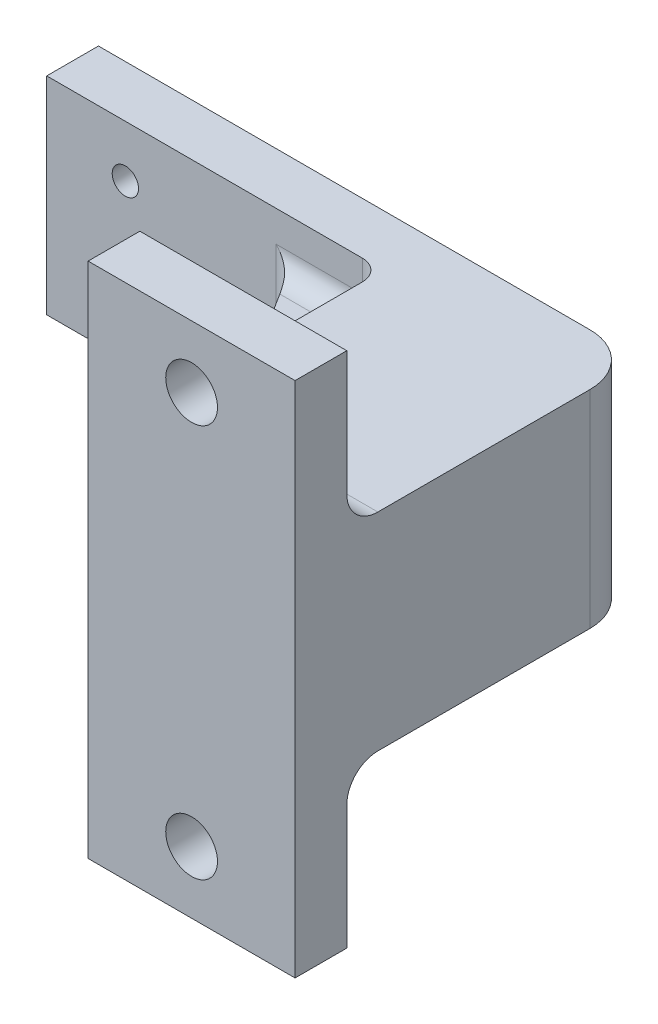
ISO-10303-21;
HEADER;
FILE_DESCRIPTION(('STEP AP214'),'2;1');
FILE_NAME('part.step','',(''),(''),'','','');
FILE_SCHEMA(('AUTOMOTIVE_DESIGN { 1 0 10303 214 1 1 1 1 }'));
ENDSEC;
DATA;
#1=APPLICATION_CONTEXT('core data for automotive mechanical design processes');
#2=APPLICATION_PROTOCOL_DEFINITION('international standard','automotive_design',2000,#1);
#3=PRODUCT_CONTEXT('',#1,'mechanical');
#4=PRODUCT('Part','Part','',(#3));
#5=PRODUCT_RELATED_PRODUCT_CATEGORY('part','',(#4));
#6=PRODUCT_DEFINITION_FORMATION('','',#4);
#7=PRODUCT_DEFINITION_CONTEXT('part definition',#1,'design');
#8=PRODUCT_DEFINITION('design','',#6,#7);
#9=PRODUCT_DEFINITION_SHAPE('','',#8);
#10=(LENGTH_UNIT() NAMED_UNIT(*) SI_UNIT(.MILLI.,.METRE.));
#11=(NAMED_UNIT(*) PLANE_ANGLE_UNIT() SI_UNIT($,.RADIAN.));
#12=(NAMED_UNIT(*) SI_UNIT($,.STERADIAN.) SOLID_ANGLE_UNIT());
#13=UNCERTAINTY_MEASURE_WITH_UNIT(LENGTH_MEASURE(1.E-05),#10,'distance_accuracy_value','');
#14=(GEOMETRIC_REPRESENTATION_CONTEXT(3) GLOBAL_UNCERTAINTY_ASSIGNED_CONTEXT((#13)) GLOBAL_UNIT_ASSIGNED_CONTEXT((#10,
#11,#12)) REPRESENTATION_CONTEXT('',''));
#15=CARTESIAN_POINT('',(0.,0.,0.));
#16=DIRECTION('',(0.,0.,1.));
#17=DIRECTION('',(1.,0.,0.));
#18=AXIS2_PLACEMENT_3D('',#15,#16,#17);
#19=CARTESIAN_POINT('',(0.,-20.,5.));
#20=DIRECTION('',(0.,1.,0.));
#21=DIRECTION('',(0.,0.,1.));
#22=AXIS2_PLACEMENT_3D('',#19,#20,#21);
#23=PLANE('',#22);
#24=DIRECTION('',(1.,0.,0.));
#25=VECTOR('',#24,1.);
#26=CARTESIAN_POINT('',(0.,-20.,0.));
#27=LINE('',#26,#25);
#28=CARTESIAN_POINT('',(0.,-20.,0.));
#29=VERTEX_POINT('',#28);
#30=CARTESIAN_POINT('',(47.5,-20.,0.));
#31=VERTEX_POINT('',#30);
#32=EDGE_CURVE('E257',#29,#31,#27,.T.);
#33=ORIENTED_EDGE('',*,*,#32,.T.);
#34=CARTESIAN_POINT('',(47.5,-20.,5.));
#35=DIRECTION('',(0.,1.,0.));
#36=DIRECTION('',(0.,0.,1.));
#37=AXIS2_PLACEMENT_3D('',#34,#35,#36);
#38=CIRCLE('',#37,5.);
#39=CARTESIAN_POINT('',(52.5,-20.,5.));
#40=VERTEX_POINT('',#39);
#41=EDGE_CURVE('E303',#31,#40,#38,.F.);
#42=ORIENTED_EDGE('',*,*,#41,.T.);
#43=DIRECTION('',(0.,0.,-1.));
#44=VECTOR('',#43,1.);
#45=CARTESIAN_POINT('',(52.5,-20.,5.));
#46=LINE('',#45,#44);
#47=CARTESIAN_POINT('',(52.5,-20.,25.5));
#48=VERTEX_POINT('',#47);
#49=EDGE_CURVE('E266',#48,#40,#46,.T.);
#50=ORIENTED_EDGE('',*,*,#49,.F.);
#51=DIRECTION('',(1.,0.,0.));
#52=VECTOR('',#51,1.);
#53=CARTESIAN_POINT('',(32.5,-20.,25.5));
#54=LINE('',#53,#52);
#55=CARTESIAN_POINT('',(32.5,-20.,25.5));
#56=VERTEX_POINT('',#55);
#57=EDGE_CURVE('E287',#48,#56,#54,.F.);
#58=ORIENTED_EDGE('',*,*,#57,.T.);
#59=DIRECTION('',(0.,0.,-1.));
#60=VECTOR('',#59,1.);
#61=CARTESIAN_POINT('',(32.5,-20.,33.5));
#62=LINE('',#61,#60);
#63=CARTESIAN_POINT('',(32.5,-20.,7.00000000000001));
#64=VERTEX_POINT('',#63);
#65=EDGE_CURVE('E226',#56,#64,#62,.T.);
#66=ORIENTED_EDGE('',*,*,#65,.T.);
#67=CARTESIAN_POINT('',(30.5,-20.,7.));
#68=DIRECTION('',(0.,1.,0.));
#69=DIRECTION('',(0.,0.,1.));
#70=AXIS2_PLACEMENT_3D('',#67,#68,#69);
#71=CIRCLE('',#70,2.);
#72=CARTESIAN_POINT('',(30.5,-20.,5.));
#73=VERTEX_POINT('',#72);
#74=EDGE_CURVE('E11',#64,#73,#71,.T.);
#75=ORIENTED_EDGE('',*,*,#74,.T.);
#76=DIRECTION('',(1.,0.,0.));
#77=VECTOR('',#76,1.);
#78=CARTESIAN_POINT('',(0.,-20.,5.));
#79=LINE('',#78,#77);
#80=CARTESIAN_POINT('',(0.,-20.,5.));
#81=VERTEX_POINT('',#80);
#82=EDGE_CURVE('E248',#81,#73,#79,.T.);
#83=ORIENTED_EDGE('',*,*,#82,.F.);
#84=DIRECTION('',(0.,0.,-1.));
#85=VECTOR('',#84,1.);
#86=CARTESIAN_POINT('',(0.,-20.,5.));
#87=LINE('',#86,#85);
#88=EDGE_CURVE('E268',#81,#29,#87,.T.);
#89=ORIENTED_EDGE('',*,*,#88,.T.);
#90=EDGE_LOOP('',(#33,#42,#50,#58,#66,#75,#83,#89));
#91=FACE_BOUND('',#90,.T.);
#92=ADVANCED_FACE('F35',(#91),#23,.F.);
#93=CARTESIAN_POINT('',(0.,0.,5.));
#94=DIRECTION('',(0.,-1.,0.));
#95=DIRECTION('',(0.,0.,-1.));
#96=AXIS2_PLACEMENT_3D('',#93,#94,#95);
#97=PLANE('',#96);
#98=DIRECTION('',(0.,0.,-1.));
#99=VECTOR('',#98,1.);
#100=CARTESIAN_POINT('',(52.5,0.,5.));
#101=LINE('',#100,#99);
#102=CARTESIAN_POINT('',(52.5,0.,25.5));
#103=VERTEX_POINT('',#102);
#104=CARTESIAN_POINT('',(52.5,0.,5.));
#105=VERTEX_POINT('',#104);
#106=EDGE_CURVE('E263',#103,#105,#101,.T.);
#107=ORIENTED_EDGE('',*,*,#106,.T.);
#108=CARTESIAN_POINT('',(47.5,0.,5.));
#109=DIRECTION('',(0.,-1.,0.));
#110=DIRECTION('',(0.,0.,-1.));
#111=AXIS2_PLACEMENT_3D('',#108,#109,#110);
#112=CIRCLE('',#111,5.);
#113=CARTESIAN_POINT('',(47.5,0.,0.));
#114=VERTEX_POINT('',#113);
#115=EDGE_CURVE('E299',#105,#114,#112,.F.);
#116=ORIENTED_EDGE('',*,*,#115,.T.);
#117=DIRECTION('',(-1.,0.,0.));
#118=VECTOR('',#117,1.);
#119=CARTESIAN_POINT('',(0.,0.,0.));
#120=LINE('',#119,#118);
#121=CARTESIAN_POINT('',(0.,0.,0.));
#122=VERTEX_POINT('',#121);
#123=EDGE_CURVE('E249',#114,#122,#120,.T.);
#124=ORIENTED_EDGE('',*,*,#123,.T.);
#125=DIRECTION('',(0.,0.,-1.));
#126=VECTOR('',#125,1.);
#127=CARTESIAN_POINT('',(0.,0.,5.));
#128=LINE('',#127,#126);
#129=CARTESIAN_POINT('',(0.,0.,5.));
#130=VERTEX_POINT('',#129);
#131=EDGE_CURVE('E254',#130,#122,#128,.T.);
#132=ORIENTED_EDGE('',*,*,#131,.F.);
#133=DIRECTION('',(-1.,0.,0.));
#134=VECTOR('',#133,1.);
#135=CARTESIAN_POINT('',(0.,0.,5.));
#136=LINE('',#135,#134);
#137=CARTESIAN_POINT('',(30.5,0.,5.));
#138=VERTEX_POINT('',#137);
#139=EDGE_CURVE('E252',#138,#130,#136,.T.);
#140=ORIENTED_EDGE('',*,*,#139,.F.);
#141=CARTESIAN_POINT('',(30.5,0.,7.));
#142=DIRECTION('',(0.,-1.,0.));
#143=DIRECTION('',(0.,0.,-1.));
#144=AXIS2_PLACEMENT_3D('',#141,#142,#143);
#145=CIRCLE('',#144,2.);
#146=CARTESIAN_POINT('',(32.5,0.,7.00000000000001));
#147=VERTEX_POINT('',#146);
#148=EDGE_CURVE('E44',#138,#147,#145,.T.);
#149=ORIENTED_EDGE('',*,*,#148,.T.);
#150=DIRECTION('',(0.,0.,-1.));
#151=VECTOR('',#150,1.);
#152=CARTESIAN_POINT('',(32.5,0.,33.5));
#153=LINE('',#152,#151);
#154=CARTESIAN_POINT('',(32.5,0.,25.5));
#155=VERTEX_POINT('',#154);
#156=EDGE_CURVE('E229',#155,#147,#153,.T.);
#157=ORIENTED_EDGE('',*,*,#156,.F.);
#158=DIRECTION('',(-1.,0.,0.));
#159=VECTOR('',#158,1.);
#160=CARTESIAN_POINT('',(52.5,0.,25.5));
#161=LINE('',#160,#159);
#162=EDGE_CURVE('E282',#155,#103,#161,.F.);
#163=ORIENTED_EDGE('',*,*,#162,.T.);
#164=EDGE_LOOP('',(#107,#116,#124,#132,#140,#149,#157,#163));
#165=FACE_BOUND('',#164,.T.);
#166=ADVANCED_FACE('F448',(#165),#97,.F.);
#167=CARTESIAN_POINT('',(0.,0.,5.));
#168=DIRECTION('',(0.,0.,1.));
#169=DIRECTION('',(1.,0.,0.));
#170=AXIS2_PLACEMENT_3D('',#167,#168,#169);
#171=PLANE('',#170);
#172=DIRECTION('',(-1.,0.,0.));
#173=VECTOR('',#172,1.);
#174=CARTESIAN_POINT('',(32.5,-3.,5.));
#175=LINE('',#174,#173);
#176=CARTESIAN_POINT('',(22.1635138026246,-3.,5.));
#177=VERTEX_POINT('',#176);
#178=CARTESIAN_POINT('',(30.5,-3.,5.));
#179=VERTEX_POINT('',#178);
#180=EDGE_CURVE('E334',#177,#179,#175,.F.);
#181=ORIENTED_EDGE('',*,*,#180,.T.);
#182=DIRECTION('',(0.,-1.,0.));
#183=VECTOR('',#182,1.);
#184=CARTESIAN_POINT('',(30.5,0.,5.));
#185=LINE('',#184,#183);
#186=EDGE_CURVE('E336',#179,#138,#185,.F.);
#187=ORIENTED_EDGE('',*,*,#186,.T.);
#188=ORIENTED_EDGE('',*,*,#139,.T.);
#189=DIRECTION('',(0.,-1.,0.));
#190=VECTOR('',#189,1.);
#191=CARTESIAN_POINT('',(0.,0.,5.));
#192=LINE('',#191,#190);
#193=EDGE_CURVE('E245',#130,#81,#192,.T.);
#194=ORIENTED_EDGE('',*,*,#193,.T.);
#195=ORIENTED_EDGE('',*,*,#82,.T.);
#196=DIRECTION('',(0.,-1.,0.));
#197=VECTOR('',#196,1.);
#198=CARTESIAN_POINT('',(30.5,0.,5.));
#199=LINE('',#198,#197);
#200=CARTESIAN_POINT('',(30.5,-17.,5.));
#201=VERTEX_POINT('',#200);
#202=EDGE_CURVE('E328',#73,#201,#199,.F.);
#203=ORIENTED_EDGE('',*,*,#202,.T.);
#204=DIRECTION('',(-1.,0.,0.));
#205=VECTOR('',#204,1.);
#206=CARTESIAN_POINT('',(0.,-17.,5.));
#207=LINE('',#206,#205);
#208=CARTESIAN_POINT('',(22.1635138026246,-17.,5.));
#209=VERTEX_POINT('',#208);
#210=EDGE_CURVE('E330',#201,#209,#207,.T.);
#211=ORIENTED_EDGE('',*,*,#210,.T.);
#212=DIRECTION('',(0.,-1.,0.));
#213=VECTOR('',#212,1.);
#214=CARTESIAN_POINT('',(22.1635138026246,-5.,5.));
#215=LINE('',#214,#213);
#216=EDGE_CURVE('E332',#209,#177,#215,.F.);
#217=ORIENTED_EDGE('',*,*,#216,.T.);
#218=EDGE_LOOP('',(#181,#187,#188,#194,#195,#203,#211,#217));
#219=FACE_BOUND('',#218,.T.);
#220=CARTESIAN_POINT('',(7.6,-5.,5.));
#221=DIRECTION('',(0.,0.,1.));
#222=DIRECTION('',(1.,0.,0.));
#223=AXIS2_PLACEMENT_3D('',#220,#221,#222);
#224=CIRCLE('',#223,1.27);
#225=CARTESIAN_POINT('',(8.87,-5.,5.));
#226=VERTEX_POINT('',#225);
#227=EDGE_CURVE('E239',#226,#226,#224,.T.);
#228=ORIENTED_EDGE('',*,*,#227,.F.);
#229=EDGE_LOOP('',(#228));
#230=FACE_BOUND('',#229,.T.);
#231=CARTESIAN_POINT('',(7.6,-15.,5.));
#232=DIRECTION('',(0.,0.,1.));
#233=DIRECTION('',(1.,0.,0.));
#234=AXIS2_PLACEMENT_3D('',#231,#232,#233);
#235=CIRCLE('',#234,1.25);
#236=CARTESIAN_POINT('',(8.85,-15.,5.));
#237=VERTEX_POINT('',#236);
#238=EDGE_CURVE('E233',#237,#237,#235,.T.);
#239=ORIENTED_EDGE('',*,*,#238,.F.);
#240=EDGE_LOOP('',(#239));
#241=FACE_BOUND('',#240,.T.);
#242=ADVANCED_FACE('F431',(#219,#230,#241),#171,.T.);
#243=CARTESIAN_POINT('',(0.,0.,0.));
#244=DIRECTION('',(0.,0.,1.));
#245=DIRECTION('',(1.,0.,0.));
#246=AXIS2_PLACEMENT_3D('',#243,#244,#245);
#247=PLANE('',#246);
#248=ORIENTED_EDGE('',*,*,#123,.F.);
#249=DIRECTION('',(0.,1.,0.));
#250=VECTOR('',#249,1.);
#251=CARTESIAN_POINT('',(47.5,0.,0.));
#252=LINE('',#251,#250);
#253=EDGE_CURVE('E301',#114,#31,#252,.F.);
#254=ORIENTED_EDGE('',*,*,#253,.T.);
#255=ORIENTED_EDGE('',*,*,#32,.F.);
#256=DIRECTION('',(0.,-1.,0.));
#257=VECTOR('',#256,1.);
#258=CARTESIAN_POINT('',(0.,0.,0.));
#259=LINE('',#258,#257);
#260=EDGE_CURVE('E242',#122,#29,#259,.T.);
#261=ORIENTED_EDGE('',*,*,#260,.F.);
#262=EDGE_LOOP('',(#248,#254,#255,#261));
#263=FACE_BOUND('',#262,.T.);
#264=CARTESIAN_POINT('',(7.6,-5.,0.));
#265=DIRECTION('',(0.,0.,1.));
#266=DIRECTION('',(1.,0.,0.));
#267=AXIS2_PLACEMENT_3D('',#264,#265,#266);
#268=CIRCLE('',#267,1.27);
#269=CARTESIAN_POINT('',(8.87,-5.,0.));
#270=VERTEX_POINT('',#269);
#271=EDGE_CURVE('E236',#270,#270,#268,.T.);
#272=ORIENTED_EDGE('',*,*,#271,.T.);
#273=EDGE_LOOP('',(#272));
#274=FACE_BOUND('',#273,.T.);
#275=CARTESIAN_POINT('',(7.6,-15.,0.));
#276=DIRECTION('',(0.,0.,1.));
#277=DIRECTION('',(1.,0.,0.));
#278=AXIS2_PLACEMENT_3D('',#275,#276,#277);
#279=CIRCLE('',#278,1.25);
#280=CARTESIAN_POINT('',(8.85,-15.,0.));
#281=VERTEX_POINT('',#280);
#282=EDGE_CURVE('E232',#281,#281,#279,.T.);
#283=ORIENTED_EDGE('',*,*,#282,.T.);
#284=EDGE_LOOP('',(#283));
#285=FACE_BOUND('',#284,.T.);
#286=ADVANCED_FACE('F504',(#263,#274,#285),#247,.F.);
#287=CARTESIAN_POINT('',(0.,0.,5.));
#288=DIRECTION('',(1.,0.,0.));
#289=DIRECTION('',(0.,0.,-1.));
#290=AXIS2_PLACEMENT_3D('',#287,#288,#289);
#291=PLANE('',#290);
#292=ORIENTED_EDGE('',*,*,#260,.T.);
#293=ORIENTED_EDGE('',*,*,#88,.F.);
#294=ORIENTED_EDGE('',*,*,#193,.F.);
#295=ORIENTED_EDGE('',*,*,#131,.T.);
#296=EDGE_LOOP('',(#292,#293,#294,#295));
#297=FACE_BOUND('',#296,.T.);
#298=ADVANCED_FACE('F439',(#297),#291,.F.);
#299=CARTESIAN_POINT('',(52.5,0.,5.));
#300=DIRECTION('',(-1.,0.,0.));
#301=DIRECTION('',(0.,0.,1.));
#302=AXIS2_PLACEMENT_3D('',#299,#300,#301);
#303=PLANE('',#302);
#304=ORIENTED_EDGE('',*,*,#49,.T.);
#305=DIRECTION('',(0.,1.,0.));
#306=VECTOR('',#305,1.);
#307=CARTESIAN_POINT('',(52.5,0.,5.));
#308=LINE('',#307,#306);
#309=EDGE_CURVE('E296',#40,#105,#308,.T.);
#310=ORIENTED_EDGE('',*,*,#309,.T.);
#311=ORIENTED_EDGE('',*,*,#106,.F.);
#312=CARTESIAN_POINT('',(52.5,3.,25.5));
#313=DIRECTION('',(-1.,0.,0.));
#314=DIRECTION('',(0.,0.,1.));
#315=AXIS2_PLACEMENT_3D('',#312,#313,#314);
#316=CIRCLE('',#315,3.);
#317=CARTESIAN_POINT('',(52.5,3.,28.5));
#318=VERTEX_POINT('',#317);
#319=EDGE_CURVE('E216',#103,#318,#316,.T.);
#320=ORIENTED_EDGE('',*,*,#319,.T.);
#321=DIRECTION('',(0.,-1.,0.));
#322=VECTOR('',#321,1.);
#323=CARTESIAN_POINT('',(52.5,15.,28.5));
#324=LINE('',#323,#322);
#325=CARTESIAN_POINT('',(52.5,15.,28.5));
#326=VERTEX_POINT('',#325);
#327=EDGE_CURVE('E194',#326,#318,#324,.T.);
#328=ORIENTED_EDGE('',*,*,#327,.F.);
#329=DIRECTION('',(0.,0.,-1.));
#330=VECTOR('',#329,1.);
#331=CARTESIAN_POINT('',(52.5,15.,33.5));
#332=LINE('',#331,#330);
#333=CARTESIAN_POINT('',(52.5,15.,33.5));
#334=VERTEX_POINT('',#333);
#335=EDGE_CURVE('E202',#334,#326,#332,.T.);
#336=ORIENTED_EDGE('',*,*,#335,.F.);
#337=DIRECTION('',(0.,1.,0.));
#338=VECTOR('',#337,1.);
#339=CARTESIAN_POINT('',(52.5,0.,33.5));
#340=LINE('',#339,#338);
#341=CARTESIAN_POINT('',(52.5,-35.,33.5));
#342=VERTEX_POINT('',#341);
#343=EDGE_CURVE('E217',#342,#334,#340,.T.);
#344=ORIENTED_EDGE('',*,*,#343,.F.);
#345=DIRECTION('',(0.,0.,-1.));
#346=VECTOR('',#345,1.);
#347=CARTESIAN_POINT('',(52.5,-35.,33.5));
#348=LINE('',#347,#346);
#349=CARTESIAN_POINT('',(52.5,-35.,28.5));
#350=VERTEX_POINT('',#349);
#351=EDGE_CURVE('E387',#342,#350,#348,.T.);
#352=ORIENTED_EDGE('',*,*,#351,.T.);
#353=CARTESIAN_POINT('',(52.5,-23.,28.5));
#354=VERTEX_POINT('',#353);
#355=EDGE_CURVE('E218',#354,#350,#324,.T.);
#356=ORIENTED_EDGE('',*,*,#355,.F.);
#357=CARTESIAN_POINT('',(52.5,-23.,25.5));
#358=DIRECTION('',(-1.,0.,0.));
#359=DIRECTION('',(0.,0.,1.));
#360=AXIS2_PLACEMENT_3D('',#357,#358,#359);
#361=CIRCLE('',#360,3.);
#362=EDGE_CURVE('E292',#354,#48,#361,.T.);
#363=ORIENTED_EDGE('',*,*,#362,.T.);
#364=EDGE_LOOP('',(#304,#310,#311,#320,#328,#336,#344,#352,#356,#363));
#365=FACE_BOUND('',#364,.T.);
#366=ADVANCED_FACE('F213',(#365),#303,.F.);
#367=CARTESIAN_POINT('',(7.6,-5.,5.));
#368=DIRECTION('',(0.,0.,-1.));
#369=DIRECTION('',(-1.,0.,0.));
#370=AXIS2_PLACEMENT_3D('',#367,#368,#369);
#371=CYLINDRICAL_SURFACE('',#370,1.27);
#372=ORIENTED_EDGE('',*,*,#227,.T.);
#373=EDGE_LOOP('',(#372));
#374=FACE_BOUND('',#373,.T.);
#375=ORIENTED_EDGE('',*,*,#271,.F.);
#376=EDGE_LOOP('',(#375));
#377=FACE_BOUND('',#376,.T.);
#378=ADVANCED_FACE('F638',(#374,#377),#371,.F.);
#379=CARTESIAN_POINT('',(7.6,-15.,5.));
#380=DIRECTION('',(0.,0.,-1.));
#381=DIRECTION('',(-1.,0.,0.));
#382=AXIS2_PLACEMENT_3D('',#379,#380,#381);
#383=CYLINDRICAL_SURFACE('',#382,1.25);
#384=ORIENTED_EDGE('',*,*,#238,.T.);
#385=EDGE_LOOP('',(#384));
#386=FACE_BOUND('',#385,.T.);
#387=ORIENTED_EDGE('',*,*,#282,.F.);
#388=EDGE_LOOP('',(#387));
#389=FACE_BOUND('',#388,.T.);
#390=ADVANCED_FACE('F606',(#386,#389),#383,.F.);
#391=CARTESIAN_POINT('',(32.5,0.,33.5));
#392=DIRECTION('',(1.,0.,0.));
#393=DIRECTION('',(0.,0.,-1.));
#394=AXIS2_PLACEMENT_3D('',#391,#392,#393);
#395=PLANE('',#394);
#396=ORIENTED_EDGE('',*,*,#156,.T.);
#397=DIRECTION('',(0.,-1.,0.));
#398=VECTOR('',#397,1.);
#399=CARTESIAN_POINT('',(32.5,0.,7.));
#400=LINE('',#399,#398);
#401=CARTESIAN_POINT('',(32.5,-3.,7.));
#402=VERTEX_POINT('',#401);
#403=EDGE_CURVE('E319',#147,#402,#400,.T.);
#404=ORIENTED_EDGE('',*,*,#403,.T.);
#405=DIRECTION('',(0.,0.,1.));
#406=VECTOR('',#405,1.);
#407=CARTESIAN_POINT('',(32.5,-3.,33.5));
#408=LINE('',#407,#406);
#409=CARTESIAN_POINT('',(32.5,-3.,20.2182174012634));
#410=VERTEX_POINT('',#409);
#411=EDGE_CURVE('E317',#402,#410,#408,.T.);
#412=ORIENTED_EDGE('',*,*,#411,.T.);
#413=DIRECTION('',(0.,-1.,0.));
#414=VECTOR('',#413,1.);
#415=CARTESIAN_POINT('',(32.5,0.,20.2182174012634));
#416=LINE('',#415,#414);
#417=CARTESIAN_POINT('',(32.5,-17.,20.2182174012634));
#418=VERTEX_POINT('',#417);
#419=EDGE_CURVE('E315',#410,#418,#416,.T.);
#420=ORIENTED_EDGE('',*,*,#419,.T.);
#421=DIRECTION('',(0.,0.,1.));
#422=VECTOR('',#421,1.);
#423=CARTESIAN_POINT('',(32.5,-17.,5.));
#424=LINE('',#423,#422);
#425=CARTESIAN_POINT('',(32.5,-17.,7.));
#426=VERTEX_POINT('',#425);
#427=EDGE_CURVE('E312',#418,#426,#424,.F.);
#428=ORIENTED_EDGE('',*,*,#427,.T.);
#429=DIRECTION('',(0.,-1.,0.));
#430=VECTOR('',#429,1.);
#431=CARTESIAN_POINT('',(32.5,0.,7.));
#432=LINE('',#431,#430);
#433=EDGE_CURVE('E310',#426,#64,#432,.T.);
#434=ORIENTED_EDGE('',*,*,#433,.T.);
#435=ORIENTED_EDGE('',*,*,#65,.F.);
#436=CARTESIAN_POINT('',(32.5,-23.,25.5));
#437=DIRECTION('',(1.,0.,0.));
#438=DIRECTION('',(0.,0.,-1.));
#439=AXIS2_PLACEMENT_3D('',#436,#437,#438);
#440=CIRCLE('',#439,3.);
#441=CARTESIAN_POINT('',(32.5,-23.,28.5));
#442=VERTEX_POINT('',#441);
#443=EDGE_CURVE('E294',#56,#442,#440,.T.);
#444=ORIENTED_EDGE('',*,*,#443,.T.);
#445=DIRECTION('',(0.,-1.,0.));
#446=VECTOR('',#445,1.);
#447=CARTESIAN_POINT('',(32.5,15.,28.5));
#448=LINE('',#447,#446);
#449=CARTESIAN_POINT('',(32.5,-35.,28.5));
#450=VERTEX_POINT('',#449);
#451=EDGE_CURVE('E391',#442,#450,#448,.T.);
#452=ORIENTED_EDGE('',*,*,#451,.T.);
#453=DIRECTION('',(0.,0.,1.));
#454=VECTOR('',#453,1.);
#455=CARTESIAN_POINT('',(32.5,-35.,33.5));
#456=LINE('',#455,#454);
#457=CARTESIAN_POINT('',(32.5,-35.,33.5));
#458=VERTEX_POINT('',#457);
#459=EDGE_CURVE('E397',#450,#458,#456,.T.);
#460=ORIENTED_EDGE('',*,*,#459,.T.);
#461=DIRECTION('',(0.,-1.,0.));
#462=VECTOR('',#461,1.);
#463=CARTESIAN_POINT('',(32.5,0.,33.5));
#464=LINE('',#463,#462);
#465=CARTESIAN_POINT('',(32.5,15.,33.5));
#466=VERTEX_POINT('',#465);
#467=EDGE_CURVE('E220',#466,#458,#464,.T.);
#468=ORIENTED_EDGE('',*,*,#467,.F.);
#469=DIRECTION('',(0.,0.,1.));
#470=VECTOR('',#469,1.);
#471=CARTESIAN_POINT('',(32.5,15.,33.5));
#472=LINE('',#471,#470);
#473=CARTESIAN_POINT('',(32.5,15.,28.5));
#474=VERTEX_POINT('',#473);
#475=EDGE_CURVE('E201',#474,#466,#472,.T.);
#476=ORIENTED_EDGE('',*,*,#475,.F.);
#477=CARTESIAN_POINT('',(32.5,3.,28.5));
#478=VERTEX_POINT('',#477);
#479=EDGE_CURVE('E197',#474,#478,#448,.T.);
#480=ORIENTED_EDGE('',*,*,#479,.T.);
#481=CARTESIAN_POINT('',(32.5,3.,25.5));
#482=DIRECTION('',(1.,0.,0.));
#483=DIRECTION('',(0.,0.,-1.));
#484=AXIS2_PLACEMENT_3D('',#481,#482,#483);
#485=CIRCLE('',#484,3.);
#486=EDGE_CURVE('E289',#478,#155,#485,.T.);
#487=ORIENTED_EDGE('',*,*,#486,.T.);
#488=EDGE_LOOP('',(#396,#404,#412,#420,#428,#434,#435,#444,#452,#460,#468,#476,#480,#487));
#489=FACE_BOUND('',#488,.T.);
#490=ADVANCED_FACE('F423',(#489),#395,.F.);
#491=CARTESIAN_POINT('',(0.,0.,33.5));
#492=DIRECTION('',(0.,0.,-1.));
#493=DIRECTION('',(-1.,0.,0.));
#494=AXIS2_PLACEMENT_3D('',#491,#492,#493);
#495=PLANE('',#494);
#496=ORIENTED_EDGE('',*,*,#343,.T.);
#497=DIRECTION('',(1.,0.,0.));
#498=VECTOR('',#497,1.);
#499=CARTESIAN_POINT('',(52.5,15.,33.5));
#500=LINE('',#499,#498);
#501=EDGE_CURVE('E208',#466,#334,#500,.T.);
#502=ORIENTED_EDGE('',*,*,#501,.F.);
#503=ORIENTED_EDGE('',*,*,#467,.T.);
#504=DIRECTION('',(1.,0.,0.));
#505=VECTOR('',#504,1.);
#506=CARTESIAN_POINT('',(52.5,-35.,33.5));
#507=LINE('',#506,#505);
#508=EDGE_CURVE('E210',#458,#342,#507,.T.);
#509=ORIENTED_EDGE('',*,*,#508,.T.);
#510=EDGE_LOOP('',(#496,#502,#503,#509));
#511=FACE_BOUND('',#510,.T.);
#512=CARTESIAN_POINT('',(42.5,9.,33.5));
#513=DIRECTION('',(0.,0.,-1.));
#514=DIRECTION('',(-1.,0.,0.));
#515=AXIS2_PLACEMENT_3D('',#512,#513,#514);
#516=CIRCLE('',#515,2.5);
#517=CARTESIAN_POINT('',(40.,9.,33.5));
#518=VERTEX_POINT('',#517);
#519=EDGE_CURVE('E280',#518,#518,#516,.T.);
#520=ORIENTED_EDGE('',*,*,#519,.T.);
#521=EDGE_LOOP('',(#520));
#522=FACE_BOUND('',#521,.T.);
#523=CARTESIAN_POINT('',(42.5,-29.,33.5));
#524=DIRECTION('',(0.,0.,-1.));
#525=DIRECTION('',(-1.,0.,0.));
#526=AXIS2_PLACEMENT_3D('',#523,#524,#525);
#527=CIRCLE('',#526,2.5);
#528=CARTESIAN_POINT('',(40.,-29.,33.5));
#529=VERTEX_POINT('',#528);
#530=EDGE_CURVE('E275',#529,#529,#527,.T.);
#531=ORIENTED_EDGE('',*,*,#530,.T.);
#532=EDGE_LOOP('',(#531));
#533=FACE_BOUND('',#532,.T.);
#534=ADVANCED_FACE('F403',(#511,#522,#533),#495,.F.);
#535=CARTESIAN_POINT('',(0.,15.,0.));
#536=DIRECTION('',(0.,1.,0.));
#537=DIRECTION('',(0.,0.,1.));
#538=AXIS2_PLACEMENT_3D('',#535,#536,#537);
#539=PLANE('',#538);
#540=ORIENTED_EDGE('',*,*,#335,.T.);
#541=DIRECTION('',(-1.,0.,0.));
#542=VECTOR('',#541,1.);
#543=CARTESIAN_POINT('',(52.5,15.,28.5));
#544=LINE('',#543,#542);
#545=EDGE_CURVE('E189',#326,#474,#544,.T.);
#546=ORIENTED_EDGE('',*,*,#545,.T.);
#547=ORIENTED_EDGE('',*,*,#475,.T.);
#548=ORIENTED_EDGE('',*,*,#501,.T.);
#549=EDGE_LOOP('',(#540,#546,#547,#548));
#550=FACE_BOUND('',#549,.T.);
#551=ADVANCED_FACE('F206',(#550),#539,.T.);
#552=CARTESIAN_POINT('',(52.5,15.,28.5));
#553=DIRECTION('',(0.,0.,1.));
#554=DIRECTION('',(1.,0.,0.));
#555=AXIS2_PLACEMENT_3D('',#552,#553,#554);
#556=PLANE('',#555);
#557=CARTESIAN_POINT('',(42.5,9.,28.5));
#558=DIRECTION('',(0.,0.,1.));
#559=DIRECTION('',(1.,0.,0.));
#560=AXIS2_PLACEMENT_3D('',#557,#558,#559);
#561=CIRCLE('',#560,2.5);
#562=CARTESIAN_POINT('',(45.,9.,28.5));
#563=VERTEX_POINT('',#562);
#564=EDGE_CURVE('E277',#563,#563,#561,.T.);
#565=ORIENTED_EDGE('',*,*,#564,.T.);
#566=EDGE_LOOP('',(#565));
#567=FACE_BOUND('',#566,.T.);
#568=ORIENTED_EDGE('',*,*,#327,.T.);
#569=DIRECTION('',(-1.,0.,0.));
#570=VECTOR('',#569,1.);
#571=CARTESIAN_POINT('',(32.5,3.,28.5));
#572=LINE('',#571,#570);
#573=EDGE_CURVE('E271',#318,#478,#572,.T.);
#574=ORIENTED_EDGE('',*,*,#573,.T.);
#575=ORIENTED_EDGE('',*,*,#479,.F.);
#576=ORIENTED_EDGE('',*,*,#545,.F.);
#577=EDGE_LOOP('',(#568,#574,#575,#576));
#578=FACE_BOUND('',#577,.T.);
#579=ADVANCED_FACE('F191',(#567,#578),#556,.F.);
#580=CARTESIAN_POINT('',(42.5,-29.,28.5));
#581=DIRECTION('',(0.,0.,1.));
#582=DIRECTION('',(1.,0.,0.));
#583=AXIS2_PLACEMENT_3D('',#580,#581,#582);
#584=CIRCLE('',#583,2.5);
#585=CARTESIAN_POINT('',(45.,-29.,28.5));
#586=VERTEX_POINT('',#585);
#587=EDGE_CURVE('E272',#586,#586,#584,.T.);
#588=ORIENTED_EDGE('',*,*,#587,.T.);
#589=EDGE_LOOP('',(#588));
#590=FACE_BOUND('',#589,.T.);
#591=ORIENTED_EDGE('',*,*,#451,.F.);
#592=DIRECTION('',(1.,0.,0.));
#593=VECTOR('',#592,1.);
#594=CARTESIAN_POINT('',(52.5,-23.,28.5));
#595=LINE('',#594,#593);
#596=EDGE_CURVE('E284',#442,#354,#595,.T.);
#597=ORIENTED_EDGE('',*,*,#596,.T.);
#598=ORIENTED_EDGE('',*,*,#355,.T.);
#599=DIRECTION('',(-1.,0.,0.));
#600=VECTOR('',#599,1.);
#601=CARTESIAN_POINT('',(52.5,-35.,28.5));
#602=LINE('',#601,#600);
#603=EDGE_CURVE('E394',#350,#450,#602,.T.);
#604=ORIENTED_EDGE('',*,*,#603,.T.);
#605=EDGE_LOOP('',(#591,#597,#598,#604));
#606=FACE_BOUND('',#605,.T.);
#607=ADVANCED_FACE('F413',(#590,#606),#556,.F.);
#608=CARTESIAN_POINT('',(0.,-35.,0.));
#609=DIRECTION('',(0.,1.,0.));
#610=DIRECTION('',(0.,0.,1.));
#611=AXIS2_PLACEMENT_3D('',#608,#609,#610);
#612=PLANE('',#611);
#613=ORIENTED_EDGE('',*,*,#351,.F.);
#614=ORIENTED_EDGE('',*,*,#508,.F.);
#615=ORIENTED_EDGE('',*,*,#459,.F.);
#616=ORIENTED_EDGE('',*,*,#603,.F.);
#617=EDGE_LOOP('',(#613,#614,#615,#616));
#618=FACE_BOUND('',#617,.T.);
#619=ADVANCED_FACE('F408',(#618),#612,.F.);
#620=CARTESIAN_POINT('',(42.5,-29.,15.5));
#621=DIRECTION('',(0.,0.,1.));
#622=DIRECTION('',(1.,0.,0.));
#623=AXIS2_PLACEMENT_3D('',#620,#621,#622);
#624=CYLINDRICAL_SURFACE('',#623,2.5);
#625=ORIENTED_EDGE('',*,*,#587,.F.);
#626=EDGE_LOOP('',(#625));
#627=FACE_BOUND('',#626,.T.);
#628=ORIENTED_EDGE('',*,*,#530,.F.);
#629=EDGE_LOOP('',(#628));
#630=FACE_BOUND('',#629,.T.);
#631=ADVANCED_FACE('F692',(#627,#630),#624,.F.);
#632=CARTESIAN_POINT('',(42.5,9.,15.5));
#633=DIRECTION('',(0.,0.,1.));
#634=DIRECTION('',(1.,0.,0.));
#635=AXIS2_PLACEMENT_3D('',#632,#633,#634);
#636=CYLINDRICAL_SURFACE('',#635,2.5);
#637=ORIENTED_EDGE('',*,*,#564,.F.);
#638=EDGE_LOOP('',(#637));
#639=FACE_BOUND('',#638,.T.);
#640=ORIENTED_EDGE('',*,*,#519,.F.);
#641=EDGE_LOOP('',(#640));
#642=FACE_BOUND('',#641,.T.);
#643=ADVANCED_FACE('F507',(#639,#642),#636,.F.);
#644=CARTESIAN_POINT('',(52.5,3.,25.5));
#645=DIRECTION('',(1.,0.,0.));
#646=DIRECTION('',(0.,0.,-1.));
#647=AXIS2_PLACEMENT_3D('',#644,#645,#646);
#648=CYLINDRICAL_SURFACE('',#647,3.);
#649=ORIENTED_EDGE('',*,*,#319,.F.);
#650=ORIENTED_EDGE('',*,*,#162,.F.);
#651=ORIENTED_EDGE('',*,*,#486,.F.);
#652=ORIENTED_EDGE('',*,*,#573,.F.);
#653=EDGE_LOOP('',(#649,#650,#651,#652));
#654=FACE_BOUND('',#653,.T.);
#655=ADVANCED_FACE('F453',(#654),#648,.F.);
#656=CARTESIAN_POINT('',(52.5,-23.,25.5));
#657=DIRECTION('',(-1.,0.,0.));
#658=DIRECTION('',(0.,0.,1.));
#659=AXIS2_PLACEMENT_3D('',#656,#657,#658);
#660=CYLINDRICAL_SURFACE('',#659,3.);
#661=ORIENTED_EDGE('',*,*,#443,.F.);
#662=ORIENTED_EDGE('',*,*,#57,.F.);
#663=ORIENTED_EDGE('',*,*,#362,.F.);
#664=ORIENTED_EDGE('',*,*,#596,.F.);
#665=EDGE_LOOP('',(#661,#662,#663,#664));
#666=FACE_BOUND('',#665,.T.);
#667=ADVANCED_FACE('F417',(#666),#660,.F.);
#668=CARTESIAN_POINT('',(23.2666880253071,-10.,5.));
#669=DIRECTION('',(-0.8458314169679,0.,0.533450292032983));
#670=DIRECTION('',(0.533450292032983,0.,0.8458314169679));
#671=AXIS2_PLACEMENT_3D('',#668,#669,#670);
#672=PLANE('',#671);
#673=CARTESIAN_POINT('',(30.5,-17.,16.469039586817));
#674=DIRECTION('',(-0.8458314169679,0.,0.533450292032983));
#675=DIRECTION('',(-0.533450292032983,0.,-0.8458314169679));
#676=AXIS2_PLACEMENT_3D('',#673,#674,#675);
#677=ELLIPSE('',#676,3.74917781444638,2.);
#678=CARTESIAN_POINT('',(30.5,-15.,16.469039586817));
#679=VERTEX_POINT('',#678);
#680=CARTESIAN_POINT('',(32.1916628339358,-15.933099415934,19.1513168171974));
#681=VERTEX_POINT('',#680);
#682=EDGE_CURVE('E338',#679,#681,#677,.F.);
#683=ORIENTED_EDGE('',*,*,#682,.T.);
#684=DIRECTION('',(0.,-1.,0.));
#685=VECTOR('',#684,1.);
#686=CARTESIAN_POINT('',(32.1916628339358,-10.,19.1513168171974));
#687=LINE('',#686,#685);
#688=CARTESIAN_POINT('',(32.1916628339358,-4.06690058406597,19.1513168171974));
#689=VERTEX_POINT('',#688);
#690=EDGE_CURVE('E326',#681,#689,#687,.F.);
#691=ORIENTED_EDGE('',*,*,#690,.T.);
#692=CARTESIAN_POINT('',(30.5,-3.,16.469039586817));
#693=DIRECTION('',(-0.8458314169679,0.,0.533450292032983));
#694=DIRECTION('',(0.533450292032983,0.,0.8458314169679));
#695=AXIS2_PLACEMENT_3D('',#692,#693,#694);
#696=ELLIPSE('',#695,3.74917781444638,2.);
#697=CARTESIAN_POINT('',(30.5,-5.,16.469039586817));
#698=VERTEX_POINT('',#697);
#699=EDGE_CURVE('E341',#689,#698,#696,.F.);
#700=ORIENTED_EDGE('',*,*,#699,.T.);
#701=DIRECTION('',(0.533450292032983,0.,0.8458314169679));
#702=VECTOR('',#701,1.);
#703=CARTESIAN_POINT('',(23.2666880253071,-5.,5.));
#704=LINE('',#703,#702);
#705=CARTESIAN_POINT('',(24.5280511795519,-5.,7.));
#706=VERTEX_POINT('',#705);
#707=EDGE_CURVE('E276',#706,#698,#704,.T.);
#708=ORIENTED_EDGE('',*,*,#707,.F.);
#709=CARTESIAN_POINT('',(24.5280511795519,-3.,7.));
#710=DIRECTION('',(-0.8458314169679,0.,0.533450292032983));
#711=DIRECTION('',(0.533450292032983,0.,0.8458314169679));
#712=AXIS2_PLACEMENT_3D('',#709,#710,#711);
#713=ELLIPSE('',#712,2.36453737692732,2.);
#714=CARTESIAN_POINT('',(23.8551766365604,-4.69166283393655,5.93309941593404));
#715=VERTEX_POINT('',#714);
#716=EDGE_CURVE('E343',#706,#715,#713,.F.);
#717=ORIENTED_EDGE('',*,*,#716,.T.);
#718=DIRECTION('',(0.,-1.,0.));
#719=VECTOR('',#718,1.);
#720=CARTESIAN_POINT('',(23.8551766365604,-15.,5.93309941593404));
#721=LINE('',#720,#719);
#722=CARTESIAN_POINT('',(23.8551766365604,-15.3083371660635,5.93309941593404));
#723=VERTEX_POINT('',#722);
#724=EDGE_CURVE('E52',#715,#723,#721,.T.);
#725=ORIENTED_EDGE('',*,*,#724,.T.);
#726=CARTESIAN_POINT('',(24.5280511795519,-17.,7.));
#727=DIRECTION('',(-0.8458314169679,0.,0.533450292032983));
#728=DIRECTION('',(-0.533450292032983,0.,-0.8458314169679));
#729=AXIS2_PLACEMENT_3D('',#726,#727,#728);
#730=ELLIPSE('',#729,2.36453737692732,2.);
#731=CARTESIAN_POINT('',(24.5280511795519,-15.,7.));
#732=VERTEX_POINT('',#731);
#733=EDGE_CURVE('E345',#723,#732,#730,.F.);
#734=ORIENTED_EDGE('',*,*,#733,.T.);
#735=DIRECTION('',(0.533450292032983,0.,0.8458314169679));
#736=VECTOR('',#735,1.);
#737=CARTESIAN_POINT('',(23.2666880253071,-15.,5.));
#738=LINE('',#737,#736);
#739=EDGE_CURVE('E375',#732,#679,#738,.T.);
#740=ORIENTED_EDGE('',*,*,#739,.T.);
#741=EDGE_LOOP('',(#683,#691,#700,#708,#717,#725,#734,#740));
#742=FACE_BOUND('',#741,.T.);
#743=ADVANCED_FACE('F475',(#742),#672,.T.);
#744=CARTESIAN_POINT('',(26.25,-5.,16.75));
#745=DIRECTION('',(0.,1.,0.));
#746=DIRECTION('',(0.,0.,1.));
#747=AXIS2_PLACEMENT_3D('',#744,#745,#746);
#748=PLANE('',#747);
#749=ORIENTED_EDGE('',*,*,#707,.T.);
#750=DIRECTION('',(0.,0.,1.));
#751=VECTOR('',#750,1.);
#752=CARTESIAN_POINT('',(30.5,-5.,16.75));
#753=LINE('',#752,#751);
#754=CARTESIAN_POINT('',(30.5,-5.,7.));
#755=VERTEX_POINT('',#754);
#756=EDGE_CURVE('E323',#698,#755,#753,.F.);
#757=ORIENTED_EDGE('',*,*,#756,.T.);
#758=DIRECTION('',(-1.,0.,0.));
#759=VECTOR('',#758,1.);
#760=CARTESIAN_POINT('',(23.2666880253071,-5.,7.));
#761=LINE('',#760,#759);
#762=EDGE_CURVE('E321',#755,#706,#761,.T.);
#763=ORIENTED_EDGE('',*,*,#762,.T.);
#764=EDGE_LOOP('',(#749,#757,#763));
#765=FACE_BOUND('',#764,.T.);
#766=ADVANCED_FACE('F586',(#765),#748,.T.);
#767=CARTESIAN_POINT('',(26.25,-15.,16.75));
#768=DIRECTION('',(0.,1.,0.));
#769=DIRECTION('',(0.,0.,1.));
#770=AXIS2_PLACEMENT_3D('',#767,#768,#769);
#771=PLANE('',#770);
#772=DIRECTION('',(-1.,0.,0.));
#773=VECTOR('',#772,1.);
#774=CARTESIAN_POINT('',(26.25,-15.,7.));
#775=LINE('',#774,#773);
#776=CARTESIAN_POINT('',(30.5,-15.,7.));
#777=VERTEX_POINT('',#776);
#778=EDGE_CURVE('E305',#732,#777,#775,.F.);
#779=ORIENTED_EDGE('',*,*,#778,.T.);
#780=DIRECTION('',(0.,0.,1.));
#781=VECTOR('',#780,1.);
#782=CARTESIAN_POINT('',(30.5,-15.,19.6402119700748));
#783=LINE('',#782,#781);
#784=EDGE_CURVE('E307',#777,#679,#783,.T.);
#785=ORIENTED_EDGE('',*,*,#784,.T.);
#786=ORIENTED_EDGE('',*,*,#739,.F.);
#787=EDGE_LOOP('',(#779,#785,#786));
#788=FACE_BOUND('',#787,.T.);
#789=ADVANCED_FACE('F477',(#788),#771,.F.);
#790=CARTESIAN_POINT('',(47.5,0.,5.));
#791=DIRECTION('',(0.,1.,0.));
#792=DIRECTION('',(0.,0.,1.));
#793=AXIS2_PLACEMENT_3D('',#790,#791,#792);
#794=CYLINDRICAL_SURFACE('',#793,5.);
#795=ORIENTED_EDGE('',*,*,#41,.F.);
#796=ORIENTED_EDGE('',*,*,#253,.F.);
#797=ORIENTED_EDGE('',*,*,#115,.F.);
#798=ORIENTED_EDGE('',*,*,#309,.F.);
#799=EDGE_LOOP('',(#795,#796,#797,#798));
#800=FACE_BOUND('',#799,.T.);
#801=ADVANCED_FACE('F446',(#800),#794,.T.);
#802=CARTESIAN_POINT('',(26.25,-3.,7.));
#803=DIRECTION('',(1.,0.,0.));
#804=DIRECTION('',(0.,0.,-1.));
#805=AXIS2_PLACEMENT_3D('',#802,#803,#804);
#806=CYLINDRICAL_SURFACE('',#805,2.);
#807=CARTESIAN_POINT('',(30.5,-3.,7.));
#808=DIRECTION('',(-1.,0.,0.));
#809=DIRECTION('',(0.,0.,1.));
#810=AXIS2_PLACEMENT_3D('',#807,#808,#809);
#811=CIRCLE('',#810,2.);
#812=EDGE_CURVE('E370',#179,#755,#811,.T.);
#813=ORIENTED_EDGE('',*,*,#812,.F.);
#814=ORIENTED_EDGE('',*,*,#180,.F.);
#815=CARTESIAN_POINT('',(22.1635138026246,-3.,7.));
#816=DIRECTION('',(0.707106781186547,0.707106781186547,0.));
#817=DIRECTION('',(-0.707106781186547,0.707106781186547,0.));
#818=AXIS2_PLACEMENT_3D('',#815,#816,#817);
#819=ELLIPSE('',#818,2.82842712474619,2.);
#820=EDGE_CURVE('E39',#715,#177,#819,.T.);
#821=ORIENTED_EDGE('',*,*,#820,.F.);
#822=ORIENTED_EDGE('',*,*,#716,.F.);
#823=ORIENTED_EDGE('',*,*,#762,.F.);
#824=EDGE_LOOP('',(#813,#814,#821,#822,#823));
#825=FACE_BOUND('',#824,.T.);
#826=ADVANCED_FACE('F37',(#825),#806,.F.);
#827=CARTESIAN_POINT('',(30.5,0.,7.));
#828=DIRECTION('',(0.,-1.,0.));
#829=DIRECTION('',(0.,0.,-1.));
#830=AXIS2_PLACEMENT_3D('',#827,#828,#829);
#831=CYLINDRICAL_SURFACE('',#830,2.);
#832=ORIENTED_EDGE('',*,*,#148,.F.);
#833=ORIENTED_EDGE('',*,*,#186,.F.);
#834=CARTESIAN_POINT('',(30.5,-3.,7.));
#835=DIRECTION('',(0.,1.,0.));
#836=DIRECTION('',(0.,0.,1.));
#837=AXIS2_PLACEMENT_3D('',#834,#835,#836);
#838=CIRCLE('',#837,2.);
#839=EDGE_CURVE('E368',#402,#179,#838,.T.);
#840=ORIENTED_EDGE('',*,*,#839,.F.);
#841=ORIENTED_EDGE('',*,*,#403,.F.);
#842=EDGE_LOOP('',(#832,#833,#840,#841));
#843=FACE_BOUND('',#842,.T.);
#844=ADVANCED_FACE('F458',(#843),#831,.F.);
#845=CARTESIAN_POINT('',(22.1635138026246,-10.,7.));
#846=DIRECTION('',(0.,1.,0.));
#847=DIRECTION('',(0.,0.,1.));
#848=AXIS2_PLACEMENT_3D('',#845,#846,#847);
#849=CYLINDRICAL_SURFACE('',#848,2.);
#850=ORIENTED_EDGE('',*,*,#820,.T.);
#851=ORIENTED_EDGE('',*,*,#216,.F.);
#852=CARTESIAN_POINT('',(22.1635138026246,-17.,7.));
#853=DIRECTION('',(-0.707106781186547,0.707106781186547,0.));
#854=DIRECTION('',(0.707106781186547,0.707106781186547,0.));
#855=AXIS2_PLACEMENT_3D('',#852,#853,#854);
#856=ELLIPSE('',#855,2.82842712474619,2.);
#857=EDGE_CURVE('E365',#723,#209,#856,.T.);
#858=ORIENTED_EDGE('',*,*,#857,.F.);
#859=ORIENTED_EDGE('',*,*,#724,.F.);
#860=EDGE_LOOP('',(#850,#851,#858,#859));
#861=FACE_BOUND('',#860,.T.);
#862=ADVANCED_FACE('F554',(#861),#849,.F.);
#863=CARTESIAN_POINT('',(30.5,-3.,7.));
#864=DIRECTION('',(0.,0.,-1.));
#865=DIRECTION('',(-1.,0.,0.));
#866=AXIS2_PLACEMENT_3D('',#863,#864,#865);
#867=SPHERICAL_SURFACE('',#866,2.);
#868=ORIENTED_EDGE('',*,*,#839,.T.);
#869=ORIENTED_EDGE('',*,*,#812,.T.);
#870=CARTESIAN_POINT('',(30.5,-3.,7.));
#871=DIRECTION('',(0.,0.,1.));
#872=DIRECTION('',(1.,0.,0.));
#873=AXIS2_PLACEMENT_3D('',#870,#871,#872);
#874=CIRCLE('',#873,2.);
#875=EDGE_CURVE('E362',#402,#755,#874,.F.);
#876=ORIENTED_EDGE('',*,*,#875,.F.);
#877=EDGE_LOOP('',(#868,#869,#876));
#878=FACE_BOUND('',#877,.T.);
#879=ADVANCED_FACE('F461',(#878),#867,.F.);
#880=CARTESIAN_POINT('',(30.5,0.,7.));
#881=DIRECTION('',(0.,-1.,0.));
#882=DIRECTION('',(0.,0.,-1.));
#883=AXIS2_PLACEMENT_3D('',#880,#881,#882);
#884=CYLINDRICAL_SURFACE('',#883,2.);
#885=ORIENTED_EDGE('',*,*,#74,.F.);
#886=ORIENTED_EDGE('',*,*,#433,.F.);
#887=CARTESIAN_POINT('',(30.5,-17.,7.));
#888=DIRECTION('',(0.,-1.,0.));
#889=DIRECTION('',(0.,0.,-1.));
#890=AXIS2_PLACEMENT_3D('',#887,#888,#889);
#891=CIRCLE('',#890,2.);
#892=EDGE_CURVE('E359',#201,#426,#891,.T.);
#893=ORIENTED_EDGE('',*,*,#892,.F.);
#894=ORIENTED_EDGE('',*,*,#202,.F.);
#895=EDGE_LOOP('',(#885,#886,#893,#894));
#896=FACE_BOUND('',#895,.T.);
#897=ADVANCED_FACE('F428',(#896),#884,.F.);
#898=CARTESIAN_POINT('',(0.,-17.,7.));
#899=DIRECTION('',(-1.,0.,0.));
#900=DIRECTION('',(0.,0.,1.));
#901=AXIS2_PLACEMENT_3D('',#898,#899,#900);
#902=CYLINDRICAL_SURFACE('',#901,2.);
#903=ORIENTED_EDGE('',*,*,#857,.T.);
#904=ORIENTED_EDGE('',*,*,#210,.F.);
#905=CARTESIAN_POINT('',(30.5,-17.,7.));
#906=DIRECTION('',(-1.,0.,0.));
#907=DIRECTION('',(0.,0.,1.));
#908=AXIS2_PLACEMENT_3D('',#905,#906,#907);
#909=CIRCLE('',#908,2.);
#910=EDGE_CURVE('E356',#777,#201,#909,.T.);
#911=ORIENTED_EDGE('',*,*,#910,.F.);
#912=ORIENTED_EDGE('',*,*,#778,.F.);
#913=ORIENTED_EDGE('',*,*,#733,.F.);
#914=EDGE_LOOP('',(#903,#904,#911,#912,#913));
#915=FACE_BOUND('',#914,.T.);
#916=ADVANCED_FACE('F482',(#915),#902,.F.);
#917=CARTESIAN_POINT('',(30.5,-3.,33.5));
#918=DIRECTION('',(0.,0.,1.));
#919=DIRECTION('',(1.,0.,0.));
#920=AXIS2_PLACEMENT_3D('',#917,#918,#919);
#921=CYLINDRICAL_SURFACE('',#920,2.);
#922=ORIENTED_EDGE('',*,*,#756,.F.);
#923=ORIENTED_EDGE('',*,*,#699,.F.);
#924=CARTESIAN_POINT('',(30.5,-3.,20.2182174012634));
#925=DIRECTION('',(0.,-0.707106781186547,0.707106781186547));
#926=DIRECTION('',(0.,-0.707106781186547,-0.707106781186547));
#927=AXIS2_PLACEMENT_3D('',#924,#925,#926);
#928=ELLIPSE('',#927,2.82842712474619,2.);
#929=EDGE_CURVE('E353',#410,#689,#928,.F.);
#930=ORIENTED_EDGE('',*,*,#929,.F.);
#931=ORIENTED_EDGE('',*,*,#411,.F.);
#932=ORIENTED_EDGE('',*,*,#875,.T.);
#933=EDGE_LOOP('',(#922,#923,#930,#931,#932));
#934=FACE_BOUND('',#933,.T.);
#935=ADVANCED_FACE('F465',(#934),#921,.F.);
#936=CARTESIAN_POINT('',(30.5,-17.,7.));
#937=DIRECTION('',(0.,0.,-1.));
#938=DIRECTION('',(-1.,0.,0.));
#939=AXIS2_PLACEMENT_3D('',#936,#937,#938);
#940=SPHERICAL_SURFACE('',#939,2.);
#941=ORIENTED_EDGE('',*,*,#910,.T.);
#942=ORIENTED_EDGE('',*,*,#892,.T.);
#943=CARTESIAN_POINT('',(30.5,-17.,7.));
#944=DIRECTION('',(0.,0.,1.));
#945=DIRECTION('',(0.,-1.,0.));
#946=AXIS2_PLACEMENT_3D('',#943,#944,#945);
#947=CIRCLE('',#946,2.);
#948=EDGE_CURVE('E351',#777,#426,#947,.F.);
#949=ORIENTED_EDGE('',*,*,#948,.F.);
#950=EDGE_LOOP('',(#941,#942,#949));
#951=FACE_BOUND('',#950,.T.);
#952=ADVANCED_FACE('F484',(#951),#940,.F.);
#953=CARTESIAN_POINT('',(30.5,0.,20.2182174012634));
#954=DIRECTION('',(0.,-1.,0.));
#955=DIRECTION('',(0.,0.,-1.));
#956=AXIS2_PLACEMENT_3D('',#953,#954,#955);
#957=CYLINDRICAL_SURFACE('',#956,2.);
#958=ORIENTED_EDGE('',*,*,#690,.F.);
#959=CARTESIAN_POINT('',(30.5,-17.,20.2182174012634));
#960=DIRECTION('',(0.,-0.707106781186547,-0.707106781186547));
#961=DIRECTION('',(0.,-0.707106781186547,0.707106781186547));
#962=AXIS2_PLACEMENT_3D('',#959,#960,#961);
#963=ELLIPSE('',#962,2.82842712474619,2.);
#964=EDGE_CURVE('E348',#418,#681,#963,.F.);
#965=ORIENTED_EDGE('',*,*,#964,.F.);
#966=ORIENTED_EDGE('',*,*,#419,.F.);
#967=ORIENTED_EDGE('',*,*,#929,.T.);
#968=EDGE_LOOP('',(#958,#965,#966,#967));
#969=FACE_BOUND('',#968,.T.);
#970=ADVANCED_FACE('F474',(#969),#957,.F.);
#971=CARTESIAN_POINT('',(30.5,-17.,16.75));
#972=DIRECTION('',(0.,0.,-1.));
#973=DIRECTION('',(-1.,0.,0.));
#974=AXIS2_PLACEMENT_3D('',#971,#972,#973);
#975=CYLINDRICAL_SURFACE('',#974,2.);
#976=ORIENTED_EDGE('',*,*,#948,.T.);
#977=ORIENTED_EDGE('',*,*,#427,.F.);
#978=ORIENTED_EDGE('',*,*,#964,.T.);
#979=ORIENTED_EDGE('',*,*,#682,.F.);
#980=ORIENTED_EDGE('',*,*,#784,.F.);
#981=EDGE_LOOP('',(#976,#977,#978,#979,#980));
#982=FACE_BOUND('',#981,.T.);
#983=ADVANCED_FACE('F471',(#982),#975,.F.);
#984=CLOSED_SHELL('',(#92,#166,#242,#286,#298,#366,#378,#390,#490,#534,#551,#579,#607,#619,#631,
#643,#655,#667,#743,#766,#789,#801,#826,#844,#862,#879,#897,#916,#935,#952,#970,#983));
#985=MANIFOLD_SOLID_BREP('B2',#984);
#986=ADVANCED_BREP_SHAPE_REPRESENTATION('',(#18,#985),#14);
#987=SHAPE_DEFINITION_REPRESENTATION(#9,#986);
ENDSEC;
END-ISO-10303-21;
